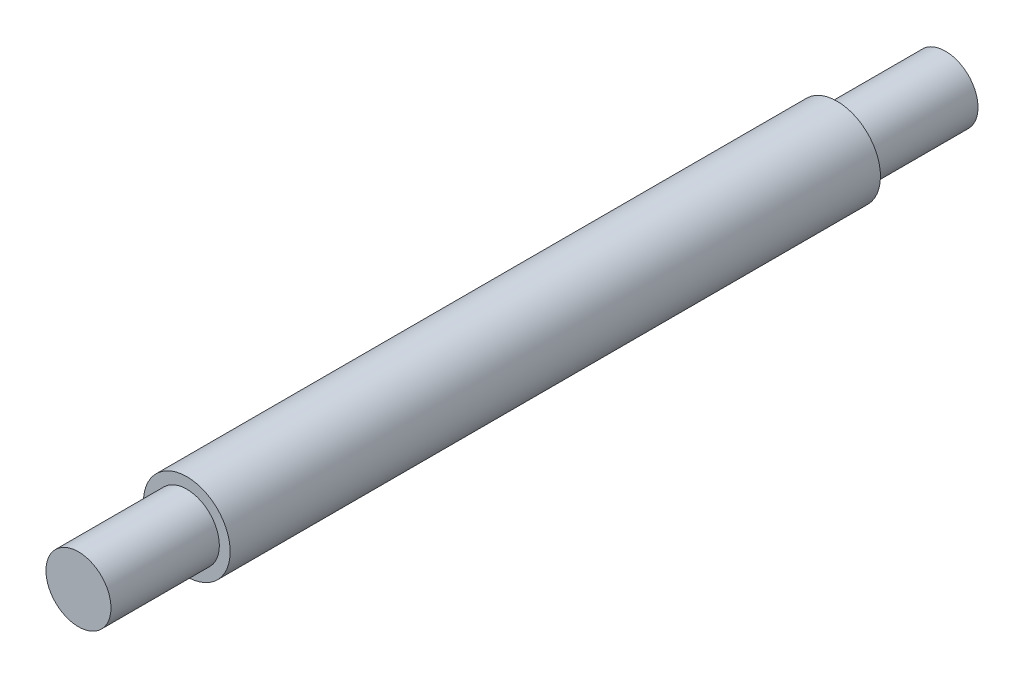
ISO-10303-21;
HEADER;
FILE_DESCRIPTION(('STEP AP214'),'2;1');
FILE_NAME('part.step','',(''),(''),'','','');
FILE_SCHEMA(('AUTOMOTIVE_DESIGN { 1 0 10303 214 1 1 1 1 }'));
ENDSEC;
DATA;
#1=APPLICATION_CONTEXT('core data for automotive mechanical design processes');
#2=APPLICATION_PROTOCOL_DEFINITION('international standard','automotive_design',2000,#1);
#3=PRODUCT_CONTEXT('',#1,'mechanical');
#4=PRODUCT('Part','Part','',(#3));
#5=PRODUCT_RELATED_PRODUCT_CATEGORY('part','',(#4));
#6=PRODUCT_DEFINITION_FORMATION('','',#4);
#7=PRODUCT_DEFINITION_CONTEXT('part definition',#1,'design');
#8=PRODUCT_DEFINITION('design','',#6,#7);
#9=PRODUCT_DEFINITION_SHAPE('','',#8);
#10=(LENGTH_UNIT() NAMED_UNIT(*) SI_UNIT(.MILLI.,.METRE.));
#11=(NAMED_UNIT(*) PLANE_ANGLE_UNIT() SI_UNIT($,.RADIAN.));
#12=(NAMED_UNIT(*) SI_UNIT($,.STERADIAN.) SOLID_ANGLE_UNIT());
#13=UNCERTAINTY_MEASURE_WITH_UNIT(LENGTH_MEASURE(1.E-05),#10,'distance_accuracy_value','');
#14=(GEOMETRIC_REPRESENTATION_CONTEXT(3) GLOBAL_UNCERTAINTY_ASSIGNED_CONTEXT((#13)) GLOBAL_UNIT_ASSIGNED_CONTEXT((#10,
#11,#12)) REPRESENTATION_CONTEXT('',''));
#15=CARTESIAN_POINT('',(0.,0.,0.));
#16=DIRECTION('',(0.,0.,1.));
#17=DIRECTION('',(1.,0.,0.));
#18=AXIS2_PLACEMENT_3D('',#15,#16,#17);
#19=CARTESIAN_POINT('',(-340.287512766377,-246.154555109847,496.914147292973));
#20=DIRECTION('',(0.,0.,1.));
#21=DIRECTION('',(0.,-1.,0.));
#22=AXIS2_PLACEMENT_3D('',#19,#20,#21);
#23=CYLINDRICAL_SURFACE('',#22,3.99999999999999);
#24=CARTESIAN_POINT('',(-340.287512766377,-246.154555109847,496.914147292973));
#25=DIRECTION('',(0.,0.,-1.));
#26=DIRECTION('',(0.,1.,0.));
#27=AXIS2_PLACEMENT_3D('',#24,#25,#26);
#28=CIRCLE('',#27,3.99999999999999);
#29=CARTESIAN_POINT('',(-340.287512766377,-242.154555109847,496.914147292973));
#30=VERTEX_POINT('',#29);
#31=EDGE_CURVE('E42',#30,#30,#28,.T.);
#32=ORIENTED_EDGE('',*,*,#31,.F.);
#33=EDGE_LOOP('',(#32));
#34=FACE_BOUND('',#33,.T.);
#35=CARTESIAN_POINT('',(-340.287512766377,-246.154555109847,556.914147292973));
#36=DIRECTION('',(0.,0.,-1.));
#37=DIRECTION('',(0.,1.,0.));
#38=AXIS2_PLACEMENT_3D('',#35,#36,#37);
#39=CIRCLE('',#38,3.99999999999999);
#40=CARTESIAN_POINT('',(-340.287512766377,-242.154555109847,556.914147292973));
#41=VERTEX_POINT('',#40);
#42=EDGE_CURVE('E33',#41,#41,#39,.T.);
#43=ORIENTED_EDGE('',*,*,#42,.T.);
#44=EDGE_LOOP('',(#43));
#45=FACE_BOUND('',#44,.T.);
#46=ADVANCED_FACE('F30',(#34,#45),#23,.T.);
#47=CARTESIAN_POINT('',(-340.287512766377,-246.154555109847,496.914147292973));
#48=DIRECTION('',(0.,0.,-1.));
#49=DIRECTION('',(0.,1.,0.));
#50=AXIS2_PLACEMENT_3D('',#47,#48,#49);
#51=PLANE('',#50);
#52=CARTESIAN_POINT('',(-340.287512766377,-246.154555109847,496.914147292973));
#53=DIRECTION('',(0.,0.,-1.));
#54=DIRECTION('',(0.,1.,0.));
#55=AXIS2_PLACEMENT_3D('',#52,#53,#54);
#56=CIRCLE('',#55,2.99999999999999);
#57=CARTESIAN_POINT('',(-340.287512766377,-243.154555109847,496.914147292973));
#58=VERTEX_POINT('',#57);
#59=EDGE_CURVE('E37',#58,#58,#56,.T.);
#60=ORIENTED_EDGE('',*,*,#59,.F.);
#61=EDGE_LOOP('',(#60));
#62=FACE_BOUND('',#61,.T.);
#63=ORIENTED_EDGE('',*,*,#31,.T.);
#64=EDGE_LOOP('',(#63));
#65=FACE_BOUND('',#64,.T.);
#66=ADVANCED_FACE('F59',(#62,#65),#51,.T.);
#67=CARTESIAN_POINT('',(-340.287512766377,-246.154555109847,556.914147292973));
#68=DIRECTION('',(0.,0.,-1.));
#69=DIRECTION('',(0.,1.,0.));
#70=AXIS2_PLACEMENT_3D('',#67,#68,#69);
#71=PLANE('',#70);
#72=CARTESIAN_POINT('',(-340.287512766377,-246.154555109847,556.914147292974));
#73=DIRECTION('',(0.,0.,1.));
#74=DIRECTION('',(1.,0.,0.));
#75=AXIS2_PLACEMENT_3D('',#72,#73,#74);
#76=CIRCLE('',#75,2.99999999999999);
#77=CARTESIAN_POINT('',(-337.287512766377,-246.154555109847,556.914147292974));
#78=VERTEX_POINT('',#77);
#79=EDGE_CURVE('E10',#78,#78,#76,.T.);
#80=ORIENTED_EDGE('',*,*,#79,.F.);
#81=EDGE_LOOP('',(#80));
#82=FACE_BOUND('',#81,.T.);
#83=ORIENTED_EDGE('',*,*,#42,.F.);
#84=EDGE_LOOP('',(#83));
#85=FACE_BOUND('',#84,.T.);
#86=ADVANCED_FACE('F56',(#82,#85),#71,.F.);
#87=CARTESIAN_POINT('',(-340.287512766377,-246.154555109847,486.914147292973));
#88=DIRECTION('',(0.,0.,1.));
#89=DIRECTION('',(0.,-1.,0.));
#90=AXIS2_PLACEMENT_3D('',#87,#88,#89);
#91=CYLINDRICAL_SURFACE('',#90,2.99999999999999);
#92=CARTESIAN_POINT('',(-340.287512766377,-246.154555109847,486.914147292973));
#93=DIRECTION('',(0.,0.,-1.));
#94=DIRECTION('',(0.,1.,0.));
#95=AXIS2_PLACEMENT_3D('',#92,#93,#94);
#96=CIRCLE('',#95,2.99999999999999);
#97=CARTESIAN_POINT('',(-340.287512766377,-243.154555109847,486.914147292973));
#98=VERTEX_POINT('',#97);
#99=EDGE_CURVE('E47',#98,#98,#96,.T.);
#100=ORIENTED_EDGE('',*,*,#99,.F.);
#101=EDGE_LOOP('',(#100));
#102=FACE_BOUND('',#101,.T.);
#103=ORIENTED_EDGE('',*,*,#59,.T.);
#104=EDGE_LOOP('',(#103));
#105=FACE_BOUND('',#104,.T.);
#106=ADVANCED_FACE('F58',(#102,#105),#91,.T.);
#107=CARTESIAN_POINT('',(-340.287512766377,-246.154555109847,486.914147292973));
#108=DIRECTION('',(0.,0.,-1.));
#109=DIRECTION('',(0.,1.,0.));
#110=AXIS2_PLACEMENT_3D('',#107,#108,#109);
#111=PLANE('',#110);
#112=ORIENTED_EDGE('',*,*,#99,.T.);
#113=EDGE_LOOP('',(#112));
#114=FACE_BOUND('',#113,.T.);
#115=ADVANCED_FACE('F65',(#114),#111,.T.);
#116=CARTESIAN_POINT('',(-340.287512766377,-246.154555109847,566.914147292974));
#117=DIRECTION('',(0.,0.,-1.));
#118=DIRECTION('',(-1.,0.,0.));
#119=AXIS2_PLACEMENT_3D('',#116,#117,#118);
#120=CYLINDRICAL_SURFACE('',#119,2.99999999999999);
#121=CARTESIAN_POINT('',(-340.287512766377,-246.154555109847,566.914147292974));
#122=DIRECTION('',(0.,0.,1.));
#123=DIRECTION('',(1.,0.,0.));
#124=AXIS2_PLACEMENT_3D('',#121,#122,#123);
#125=CIRCLE('',#124,2.99999999999999);
#126=CARTESIAN_POINT('',(-337.287512766377,-246.154555109847,566.914147292974));
#127=VERTEX_POINT('',#126);
#128=EDGE_CURVE('E46',#127,#127,#125,.T.);
#129=ORIENTED_EDGE('',*,*,#128,.F.);
#130=EDGE_LOOP('',(#129));
#131=FACE_BOUND('',#130,.T.);
#132=ORIENTED_EDGE('',*,*,#79,.T.);
#133=EDGE_LOOP('',(#132));
#134=FACE_BOUND('',#133,.T.);
#135=ADVANCED_FACE('F93',(#131,#134),#120,.T.);
#136=CARTESIAN_POINT('',(-340.287512766377,-246.154555109847,566.914147292974));
#137=DIRECTION('',(0.,0.,1.));
#138=DIRECTION('',(1.,0.,0.));
#139=AXIS2_PLACEMENT_3D('',#136,#137,#138);
#140=PLANE('',#139);
#141=ORIENTED_EDGE('',*,*,#128,.T.);
#142=EDGE_LOOP('',(#141));
#143=FACE_BOUND('',#142,.T.);
#144=ADVANCED_FACE('F107',(#143),#140,.T.);
#145=CLOSED_SHELL('',(#46,#66,#86,#106,#115,#135,#144));
#146=MANIFOLD_SOLID_BREP('B2',#145);
#147=ADVANCED_BREP_SHAPE_REPRESENTATION('',(#18,#146),#14);
#148=SHAPE_DEFINITION_REPRESENTATION(#9,#147);
ENDSEC;
END-ISO-10303-21;
